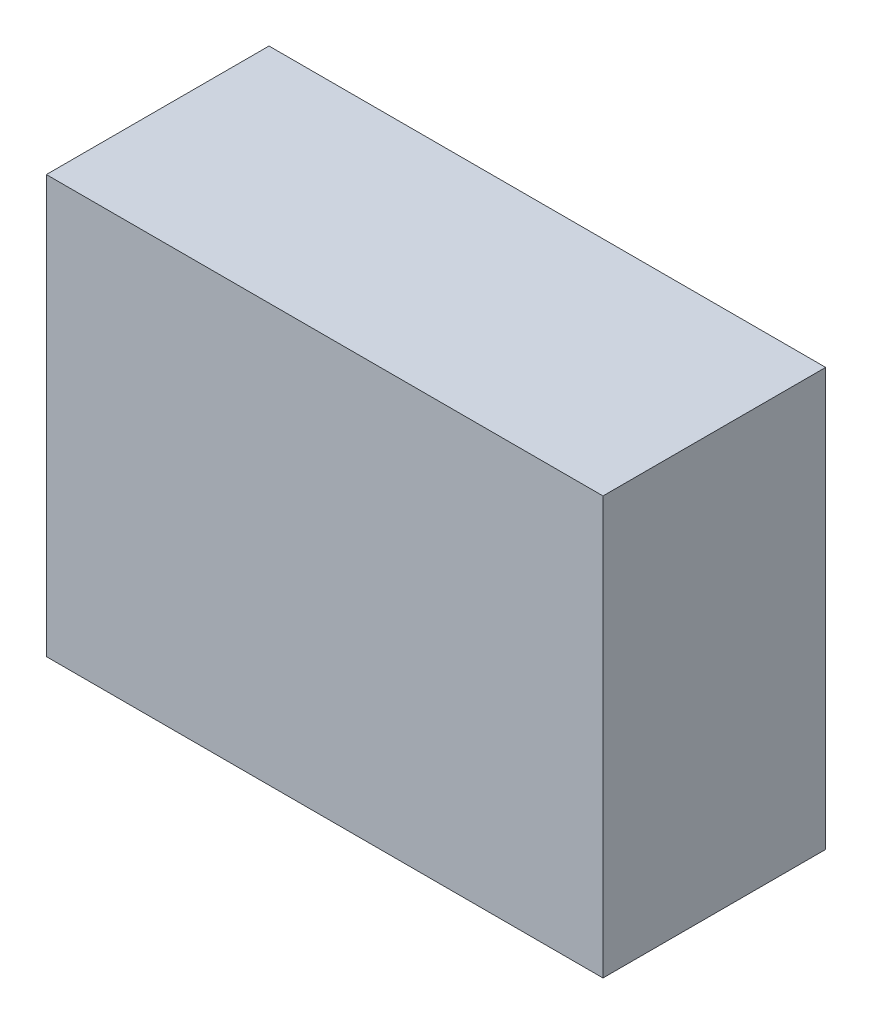
ISO-10303-21;
HEADER;
FILE_DESCRIPTION(('STEP AP214'),'2;1');
FILE_NAME('part.step','',(''),(''),'','','');
FILE_SCHEMA(('AUTOMOTIVE_DESIGN { 1 0 10303 214 1 1 1 1 }'));
ENDSEC;
DATA;
#1=APPLICATION_CONTEXT('core data for automotive mechanical design processes');
#2=APPLICATION_PROTOCOL_DEFINITION('international standard','automotive_design',2000,#1);
#3=PRODUCT_CONTEXT('',#1,'mechanical');
#4=PRODUCT('Part','Part','',(#3));
#5=PRODUCT_RELATED_PRODUCT_CATEGORY('part','',(#4));
#6=PRODUCT_DEFINITION_FORMATION('','',#4);
#7=PRODUCT_DEFINITION_CONTEXT('part definition',#1,'design');
#8=PRODUCT_DEFINITION('design','',#6,#7);
#9=PRODUCT_DEFINITION_SHAPE('','',#8);
#10=(LENGTH_UNIT() NAMED_UNIT(*) SI_UNIT(.MILLI.,.METRE.));
#11=(NAMED_UNIT(*) PLANE_ANGLE_UNIT() SI_UNIT($,.RADIAN.));
#12=(NAMED_UNIT(*) SI_UNIT($,.STERADIAN.) SOLID_ANGLE_UNIT());
#13=UNCERTAINTY_MEASURE_WITH_UNIT(LENGTH_MEASURE(1.E-05),#10,'distance_accuracy_value','');
#14=(GEOMETRIC_REPRESENTATION_CONTEXT(3) GLOBAL_UNCERTAINTY_ASSIGNED_CONTEXT((#13)) GLOBAL_UNIT_ASSIGNED_CONTEXT((#10,
#11,#12)) REPRESENTATION_CONTEXT('',''));
#15=CARTESIAN_POINT('',(0.,0.,0.));
#16=DIRECTION('',(0.,0.,1.));
#17=DIRECTION('',(1.,0.,0.));
#18=AXIS2_PLACEMENT_3D('',#15,#16,#17);
#19=CARTESIAN_POINT('',(-400.,-300.,320.));
#20=DIRECTION('',(0.,1.,0.));
#21=DIRECTION('',(0.,0.,1.));
#22=AXIS2_PLACEMENT_3D('',#19,#20,#21);
#23=PLANE('',#22);
#24=DIRECTION('',(1.,0.,0.));
#25=VECTOR('',#24,1.);
#26=CARTESIAN_POINT('',(-400.,-300.,0.));
#27=LINE('',#26,#25);
#28=CARTESIAN_POINT('',(-400.,-300.,0.));
#29=VERTEX_POINT('',#28);
#30=CARTESIAN_POINT('',(400.,-300.,0.));
#31=VERTEX_POINT('',#30);
#32=EDGE_CURVE('E99',#29,#31,#27,.T.);
#33=ORIENTED_EDGE('',*,*,#32,.T.);
#34=DIRECTION('',(0.,0.,-1.));
#35=VECTOR('',#34,1.);
#36=CARTESIAN_POINT('',(400.,-300.,320.));
#37=LINE('',#36,#35);
#38=CARTESIAN_POINT('',(400.,-300.,320.));
#39=VERTEX_POINT('',#38);
#40=EDGE_CURVE('E11',#39,#31,#37,.T.);
#41=ORIENTED_EDGE('',*,*,#40,.F.);
#42=DIRECTION('',(1.,0.,0.));
#43=VECTOR('',#42,1.);
#44=CARTESIAN_POINT('',(-400.,-300.,320.));
#45=LINE('',#44,#43);
#46=CARTESIAN_POINT('',(-400.,-300.,320.));
#47=VERTEX_POINT('',#46);
#48=EDGE_CURVE('E76',#47,#39,#45,.T.);
#49=ORIENTED_EDGE('',*,*,#48,.F.);
#50=DIRECTION('',(0.,0.,-1.));
#51=VECTOR('',#50,1.);
#52=CARTESIAN_POINT('',(-400.,-300.,320.));
#53=LINE('',#52,#51);
#54=EDGE_CURVE('E95',#47,#29,#53,.T.);
#55=ORIENTED_EDGE('',*,*,#54,.T.);
#56=EDGE_LOOP('',(#33,#41,#49,#55));
#57=FACE_BOUND('',#56,.T.);
#58=ADVANCED_FACE('F37',(#57),#23,.F.);
#59=CARTESIAN_POINT('',(400.,300.,320.));
#60=DIRECTION('',(1.,0.,0.));
#61=DIRECTION('',(0.,1.,0.));
#62=AXIS2_PLACEMENT_3D('',#59,#60,#61);
#63=PLANE('',#62);
#64=DIRECTION('',(0.,-1.,0.));
#65=VECTOR('',#64,1.);
#66=CARTESIAN_POINT('',(400.,300.,0.));
#67=LINE('',#66,#65);
#68=CARTESIAN_POINT('',(400.,300.,0.));
#69=VERTEX_POINT('',#68);
#70=EDGE_CURVE('E85',#69,#31,#67,.T.);
#71=ORIENTED_EDGE('',*,*,#70,.F.);
#72=DIRECTION('',(0.,0.,-1.));
#73=VECTOR('',#72,1.);
#74=CARTESIAN_POINT('',(400.,300.,320.));
#75=LINE('',#74,#73);
#76=CARTESIAN_POINT('',(400.,300.,320.));
#77=VERTEX_POINT('',#76);
#78=EDGE_CURVE('E45',#77,#69,#75,.T.);
#79=ORIENTED_EDGE('',*,*,#78,.F.);
#80=DIRECTION('',(0.,-1.,0.));
#81=VECTOR('',#80,1.);
#82=CARTESIAN_POINT('',(400.,300.,320.));
#83=LINE('',#82,#81);
#84=EDGE_CURVE('E83',#77,#39,#83,.T.);
#85=ORIENTED_EDGE('',*,*,#84,.T.);
#86=ORIENTED_EDGE('',*,*,#40,.T.);
#87=EDGE_LOOP('',(#71,#79,#85,#86));
#88=FACE_BOUND('',#87,.T.);
#89=ADVANCED_FACE('F82',(#88),#63,.T.);
#90=CARTESIAN_POINT('',(-400.,300.,320.));
#91=DIRECTION('',(0.,1.,0.));
#92=DIRECTION('',(0.,0.,1.));
#93=AXIS2_PLACEMENT_3D('',#90,#91,#92);
#94=PLANE('',#93);
#95=DIRECTION('',(1.,0.,0.));
#96=VECTOR('',#95,1.);
#97=CARTESIAN_POINT('',(-400.,300.,0.));
#98=LINE('',#97,#96);
#99=CARTESIAN_POINT('',(-400.,300.,0.));
#100=VERTEX_POINT('',#99);
#101=EDGE_CURVE('E103',#100,#69,#98,.T.);
#102=ORIENTED_EDGE('',*,*,#101,.F.);
#103=DIRECTION('',(0.,0.,-1.));
#104=VECTOR('',#103,1.);
#105=CARTESIAN_POINT('',(-400.,300.,320.));
#106=LINE('',#105,#104);
#107=CARTESIAN_POINT('',(-400.,300.,320.));
#108=VERTEX_POINT('',#107);
#109=EDGE_CURVE('E68',#108,#100,#106,.T.);
#110=ORIENTED_EDGE('',*,*,#109,.F.);
#111=DIRECTION('',(1.,0.,0.));
#112=VECTOR('',#111,1.);
#113=CARTESIAN_POINT('',(-400.,300.,320.));
#114=LINE('',#113,#112);
#115=EDGE_CURVE('E91',#108,#77,#114,.T.);
#116=ORIENTED_EDGE('',*,*,#115,.T.);
#117=ORIENTED_EDGE('',*,*,#78,.T.);
#118=EDGE_LOOP('',(#102,#110,#116,#117));
#119=FACE_BOUND('',#118,.T.);
#120=ADVANCED_FACE('F93',(#119),#94,.T.);
#121=CARTESIAN_POINT('',(-400.,300.,320.));
#122=DIRECTION('',(1.,0.,0.));
#123=DIRECTION('',(0.,1.,0.));
#124=AXIS2_PLACEMENT_3D('',#121,#122,#123);
#125=PLANE('',#124);
#126=DIRECTION('',(0.,-1.,0.));
#127=VECTOR('',#126,1.);
#128=CARTESIAN_POINT('',(-400.,300.,0.));
#129=LINE('',#128,#127);
#130=EDGE_CURVE('E71',#100,#29,#129,.T.);
#131=ORIENTED_EDGE('',*,*,#130,.T.);
#132=ORIENTED_EDGE('',*,*,#54,.F.);
#133=DIRECTION('',(0.,-1.,0.));
#134=VECTOR('',#133,1.);
#135=CARTESIAN_POINT('',(-400.,300.,320.));
#136=LINE('',#135,#134);
#137=EDGE_CURVE('E53',#108,#47,#136,.T.);
#138=ORIENTED_EDGE('',*,*,#137,.F.);
#139=ORIENTED_EDGE('',*,*,#109,.T.);
#140=EDGE_LOOP('',(#131,#132,#138,#139));
#141=FACE_BOUND('',#140,.T.);
#142=ADVANCED_FACE('F116',(#141),#125,.F.);
#143=CARTESIAN_POINT('',(0.,0.,320.));
#144=DIRECTION('',(0.,0.,-1.));
#145=DIRECTION('',(-1.,0.,0.));
#146=AXIS2_PLACEMENT_3D('',#143,#144,#145);
#147=PLANE('',#146);
#148=ORIENTED_EDGE('',*,*,#48,.T.);
#149=ORIENTED_EDGE('',*,*,#84,.F.);
#150=ORIENTED_EDGE('',*,*,#115,.F.);
#151=ORIENTED_EDGE('',*,*,#137,.T.);
#152=EDGE_LOOP('',(#148,#149,#150,#151));
#153=FACE_BOUND('',#152,.T.);
#154=ADVANCED_FACE('F90',(#153),#147,.F.);
#155=CARTESIAN_POINT('',(0.,0.,0.));
#156=DIRECTION('',(0.,0.,-1.));
#157=DIRECTION('',(-1.,0.,0.));
#158=AXIS2_PLACEMENT_3D('',#155,#156,#157);
#159=PLANE('',#158);
#160=ORIENTED_EDGE('',*,*,#32,.F.);
#161=ORIENTED_EDGE('',*,*,#130,.F.);
#162=ORIENTED_EDGE('',*,*,#101,.T.);
#163=ORIENTED_EDGE('',*,*,#70,.T.);
#164=EDGE_LOOP('',(#160,#161,#162,#163));
#165=FACE_BOUND('',#164,.T.);
#166=ADVANCED_FACE('F110',(#165),#159,.T.);
#167=CLOSED_SHELL('',(#58,#89,#120,#142,#154,#166));
#168=MANIFOLD_SOLID_BREP('B2',#167);
#169=ADVANCED_BREP_SHAPE_REPRESENTATION('',(#18,#168),#14);
#170=SHAPE_DEFINITION_REPRESENTATION(#9,#169);
ENDSEC;
END-ISO-10303-21;
